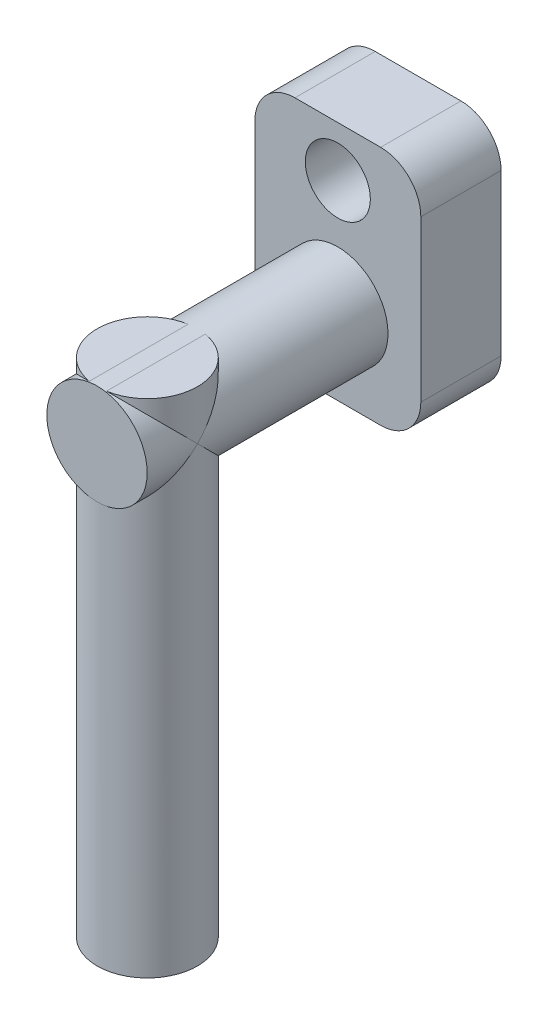
ISO-10303-21;
HEADER;
FILE_DESCRIPTION(('STEP AP214'),'2;1');
FILE_NAME('part.step','',(''),(''),'','','');
FILE_SCHEMA(('AUTOMOTIVE_DESIGN { 1 0 10303 214 1 1 1 1 }'));
ENDSEC;
DATA;
#1=APPLICATION_CONTEXT('core data for automotive mechanical design processes');
#2=APPLICATION_PROTOCOL_DEFINITION('international standard','automotive_design',2000,#1);
#3=PRODUCT_CONTEXT('',#1,'mechanical');
#4=PRODUCT('Part','Part','',(#3));
#5=PRODUCT_RELATED_PRODUCT_CATEGORY('part','',(#4));
#6=PRODUCT_DEFINITION_FORMATION('','',#4);
#7=PRODUCT_DEFINITION_CONTEXT('part definition',#1,'design');
#8=PRODUCT_DEFINITION('design','',#6,#7);
#9=PRODUCT_DEFINITION_SHAPE('','',#8);
#10=(LENGTH_UNIT() NAMED_UNIT(*) SI_UNIT(.MILLI.,.METRE.));
#11=(NAMED_UNIT(*) PLANE_ANGLE_UNIT() SI_UNIT($,.RADIAN.));
#12=(NAMED_UNIT(*) SI_UNIT($,.STERADIAN.) SOLID_ANGLE_UNIT());
#13=UNCERTAINTY_MEASURE_WITH_UNIT(LENGTH_MEASURE(1.E-05),#10,'distance_accuracy_value','');
#14=(GEOMETRIC_REPRESENTATION_CONTEXT(3) GLOBAL_UNCERTAINTY_ASSIGNED_CONTEXT((#13)) GLOBAL_UNIT_ASSIGNED_CONTEXT((#10,
#11,#12)) REPRESENTATION_CONTEXT('',''));
#15=CARTESIAN_POINT('',(0.,0.,0.));
#16=DIRECTION('',(0.,0.,1.));
#17=DIRECTION('',(1.,0.,0.));
#18=AXIS2_PLACEMENT_3D('',#15,#16,#17);
#19=CARTESIAN_POINT('',(4.135,6.,4.));
#20=DIRECTION('',(-1.,0.,0.));
#21=DIRECTION('',(0.,-1.,0.));
#22=AXIS2_PLACEMENT_3D('',#19,#20,#21);
#23=PLANE('',#22);
#24=DIRECTION('',(0.,1.,0.));
#25=VECTOR('',#24,1.);
#26=CARTESIAN_POINT('',(4.135,6.,4.));
#27=LINE('',#26,#25);
#28=CARTESIAN_POINT('',(4.135,-4.,4.));
#29=VERTEX_POINT('',#28);
#30=CARTESIAN_POINT('',(4.135,4.,4.));
#31=VERTEX_POINT('',#30);
#32=EDGE_CURVE('E184',#29,#31,#27,.T.);
#33=ORIENTED_EDGE('',*,*,#32,.F.);
#34=DIRECTION('',(0.,0.,-1.));
#35=VECTOR('',#34,1.);
#36=CARTESIAN_POINT('',(4.135,-4.,4.));
#37=LINE('',#36,#35);
#38=CARTESIAN_POINT('',(4.135,-4.,0.));
#39=VERTEX_POINT('',#38);
#40=EDGE_CURVE('E144',#29,#39,#37,.T.);
#41=ORIENTED_EDGE('',*,*,#40,.T.);
#42=DIRECTION('',(0.,1.,0.));
#43=VECTOR('',#42,1.);
#44=CARTESIAN_POINT('',(4.135,6.,0.));
#45=LINE('',#44,#43);
#46=CARTESIAN_POINT('',(4.135,4.,0.));
#47=VERTEX_POINT('',#46);
#48=EDGE_CURVE('E191',#39,#47,#45,.T.);
#49=ORIENTED_EDGE('',*,*,#48,.T.);
#50=DIRECTION('',(0.,0.,-1.));
#51=VECTOR('',#50,1.);
#52=CARTESIAN_POINT('',(4.135,4.,4.));
#53=LINE('',#52,#51);
#54=EDGE_CURVE('E171',#47,#31,#53,.F.);
#55=ORIENTED_EDGE('',*,*,#54,.T.);
#56=EDGE_LOOP('',(#33,#41,#49,#55));
#57=FACE_BOUND('',#56,.T.);
#58=ADVANCED_FACE('F35',(#57),#23,.F.);
#59=CARTESIAN_POINT('',(-4.135,6.,4.));
#60=DIRECTION('',(0.,-1.,0.));
#61=DIRECTION('',(1.,0.,0.));
#62=AXIS2_PLACEMENT_3D('',#59,#60,#61);
#63=PLANE('',#62);
#64=DIRECTION('',(-1.,0.,0.));
#65=VECTOR('',#64,1.);
#66=CARTESIAN_POINT('',(-4.135,6.,0.));
#67=LINE('',#66,#65);
#68=CARTESIAN_POINT('',(2.135,6.,0.));
#69=VERTEX_POINT('',#68);
#70=CARTESIAN_POINT('',(-2.135,6.,0.));
#71=VERTEX_POINT('',#70);
#72=EDGE_CURVE('E188',#69,#71,#67,.T.);
#73=ORIENTED_EDGE('',*,*,#72,.T.);
#74=DIRECTION('',(0.,0.,-1.));
#75=VECTOR('',#74,1.);
#76=CARTESIAN_POINT('',(-2.135,6.,4.));
#77=LINE('',#76,#75);
#78=CARTESIAN_POINT('',(-2.135,6.,4.));
#79=VERTEX_POINT('',#78);
#80=EDGE_CURVE('E142',#71,#79,#77,.F.);
#81=ORIENTED_EDGE('',*,*,#80,.T.);
#82=DIRECTION('',(-1.,0.,0.));
#83=VECTOR('',#82,1.);
#84=CARTESIAN_POINT('',(-4.135,6.,4.));
#85=LINE('',#84,#83);
#86=CARTESIAN_POINT('',(2.135,6.,4.));
#87=VERTEX_POINT('',#86);
#88=EDGE_CURVE('E199',#87,#79,#85,.T.);
#89=ORIENTED_EDGE('',*,*,#88,.F.);
#90=DIRECTION('',(0.,0.,-1.));
#91=VECTOR('',#90,1.);
#92=CARTESIAN_POINT('',(2.135,6.,4.));
#93=LINE('',#92,#91);
#94=EDGE_CURVE('E177',#87,#69,#93,.T.);
#95=ORIENTED_EDGE('',*,*,#94,.T.);
#96=EDGE_LOOP('',(#73,#81,#89,#95));
#97=FACE_BOUND('',#96,.T.);
#98=ADVANCED_FACE('F230',(#97),#63,.F.);
#99=CARTESIAN_POINT('',(-4.135,6.,4.));
#100=DIRECTION('',(1.,0.,0.));
#101=DIRECTION('',(0.,1.,0.));
#102=AXIS2_PLACEMENT_3D('',#99,#100,#101);
#103=PLANE('',#102);
#104=DIRECTION('',(0.,-1.,0.));
#105=VECTOR('',#104,1.);
#106=CARTESIAN_POINT('',(-4.135,6.,0.));
#107=LINE('',#106,#105);
#108=CARTESIAN_POINT('',(-4.135,4.,0.));
#109=VERTEX_POINT('',#108);
#110=CARTESIAN_POINT('',(-4.135,-4.,0.));
#111=VERTEX_POINT('',#110);
#112=EDGE_CURVE('E185',#109,#111,#107,.T.);
#113=ORIENTED_EDGE('',*,*,#112,.T.);
#114=DIRECTION('',(0.,0.,-1.));
#115=VECTOR('',#114,1.);
#116=CARTESIAN_POINT('',(-4.135,-4.,4.));
#117=LINE('',#116,#115);
#118=CARTESIAN_POINT('',(-4.135,-4.,4.));
#119=VERTEX_POINT('',#118);
#120=EDGE_CURVE('E153',#111,#119,#117,.F.);
#121=ORIENTED_EDGE('',*,*,#120,.T.);
#122=DIRECTION('',(0.,-1.,0.));
#123=VECTOR('',#122,1.);
#124=CARTESIAN_POINT('',(-4.135,6.,4.));
#125=LINE('',#124,#123);
#126=CARTESIAN_POINT('',(-4.135,4.,4.));
#127=VERTEX_POINT('',#126);
#128=EDGE_CURVE('E196',#127,#119,#125,.T.);
#129=ORIENTED_EDGE('',*,*,#128,.F.);
#130=DIRECTION('',(0.,0.,-1.));
#131=VECTOR('',#130,1.);
#132=CARTESIAN_POINT('',(-4.135,4.,4.));
#133=LINE('',#132,#131);
#134=EDGE_CURVE('E155',#127,#109,#133,.T.);
#135=ORIENTED_EDGE('',*,*,#134,.T.);
#136=EDGE_LOOP('',(#113,#121,#129,#135));
#137=FACE_BOUND('',#136,.T.);
#138=ADVANCED_FACE('F236',(#137),#103,.F.);
#139=CARTESIAN_POINT('',(-4.135,-6.,4.));
#140=DIRECTION('',(0.,1.,0.));
#141=DIRECTION('',(0.,0.,1.));
#142=AXIS2_PLACEMENT_3D('',#139,#140,#141);
#143=PLANE('',#142);
#144=DIRECTION('',(1.,0.,0.));
#145=VECTOR('',#144,1.);
#146=CARTESIAN_POINT('',(-4.135,-6.,4.));
#147=LINE('',#146,#145);
#148=CARTESIAN_POINT('',(-2.135,-6.,4.));
#149=VERTEX_POINT('',#148);
#150=CARTESIAN_POINT('',(2.135,-6.,4.));
#151=VERTEX_POINT('',#150);
#152=EDGE_CURVE('E180',#149,#151,#147,.T.);
#153=ORIENTED_EDGE('',*,*,#152,.F.);
#154=DIRECTION('',(0.,0.,-1.));
#155=VECTOR('',#154,1.);
#156=CARTESIAN_POINT('',(-2.135,-6.,4.));
#157=LINE('',#156,#155);
#158=CARTESIAN_POINT('',(-2.135,-6.,0.));
#159=VERTEX_POINT('',#158);
#160=EDGE_CURVE('E164',#149,#159,#157,.T.);
#161=ORIENTED_EDGE('',*,*,#160,.T.);
#162=DIRECTION('',(1.,0.,0.));
#163=VECTOR('',#162,1.);
#164=CARTESIAN_POINT('',(-4.135,-6.,0.));
#165=LINE('',#164,#163);
#166=CARTESIAN_POINT('',(2.135,-6.,0.));
#167=VERTEX_POINT('',#166);
#168=EDGE_CURVE('E181',#159,#167,#165,.T.);
#169=ORIENTED_EDGE('',*,*,#168,.T.);
#170=DIRECTION('',(0.,0.,-1.));
#171=VECTOR('',#170,1.);
#172=CARTESIAN_POINT('',(2.135,-6.,4.));
#173=LINE('',#172,#171);
#174=EDGE_CURVE('E167',#167,#151,#173,.F.);
#175=ORIENTED_EDGE('',*,*,#174,.T.);
#176=EDGE_LOOP('',(#153,#161,#169,#175));
#177=FACE_BOUND('',#176,.T.);
#178=ADVANCED_FACE('F280',(#177),#143,.F.);
#179=CARTESIAN_POINT('',(0.,0.,4.));
#180=DIRECTION('',(0.,0.,1.));
#181=DIRECTION('',(1.,0.,0.));
#182=AXIS2_PLACEMENT_3D('',#179,#180,#181);
#183=PLANE('',#182);
#184=CARTESIAN_POINT('',(0.,-1.86312088986675,4.));
#185=DIRECTION('',(0.,0.,1.));
#186=DIRECTION('',(1.,0.,0.));
#187=AXIS2_PLACEMENT_3D('',#184,#185,#186);
#188=CIRCLE('',#187,2.5);
#189=CARTESIAN_POINT('',(2.5,-1.86312088986675,4.));
#190=VERTEX_POINT('',#189);
#191=EDGE_CURVE('E209',#190,#190,#188,.T.);
#192=ORIENTED_EDGE('',*,*,#191,.F.);
#193=EDGE_LOOP('',(#192));
#194=FACE_BOUND('',#193,.T.);
#195=CARTESIAN_POINT('',(0.,3.5,4.));
#196=DIRECTION('',(0.,0.,1.));
#197=DIRECTION('',(1.,0.,0.));
#198=AXIS2_PLACEMENT_3D('',#195,#196,#197);
#199=CIRCLE('',#198,1.62);
#200=CARTESIAN_POINT('',(1.62,3.5,4.));
#201=VERTEX_POINT('',#200);
#202=EDGE_CURVE('E203',#201,#201,#199,.T.);
#203=ORIENTED_EDGE('',*,*,#202,.F.);
#204=EDGE_LOOP('',(#203));
#205=FACE_BOUND('',#204,.T.);
#206=ORIENTED_EDGE('',*,*,#128,.T.);
#207=CARTESIAN_POINT('',(-2.135,-4.,4.));
#208=DIRECTION('',(0.,0.,1.));
#209=DIRECTION('',(1.,0.,0.));
#210=AXIS2_PLACEMENT_3D('',#207,#208,#209);
#211=CIRCLE('',#210,2.);
#212=EDGE_CURVE('E147',#119,#149,#211,.T.);
#213=ORIENTED_EDGE('',*,*,#212,.T.);
#214=ORIENTED_EDGE('',*,*,#152,.T.);
#215=CARTESIAN_POINT('',(2.135,-4.,4.));
#216=DIRECTION('',(0.,0.,1.));
#217=DIRECTION('',(1.,0.,0.));
#218=AXIS2_PLACEMENT_3D('',#215,#216,#217);
#219=CIRCLE('',#218,2.);
#220=EDGE_CURVE('E149',#151,#29,#219,.T.);
#221=ORIENTED_EDGE('',*,*,#220,.T.);
#222=ORIENTED_EDGE('',*,*,#32,.T.);
#223=CARTESIAN_POINT('',(2.135,4.,4.));
#224=DIRECTION('',(0.,0.,1.));
#225=DIRECTION('',(1.,0.,0.));
#226=AXIS2_PLACEMENT_3D('',#223,#224,#225);
#227=CIRCLE('',#226,2.);
#228=EDGE_CURVE('E169',#31,#87,#227,.T.);
#229=ORIENTED_EDGE('',*,*,#228,.T.);
#230=ORIENTED_EDGE('',*,*,#88,.T.);
#231=CARTESIAN_POINT('',(-2.135,4.,4.));
#232=DIRECTION('',(0.,0.,1.));
#233=DIRECTION('',(1.,0.,0.));
#234=AXIS2_PLACEMENT_3D('',#231,#232,#233);
#235=CIRCLE('',#234,2.);
#236=EDGE_CURVE('E151',#79,#127,#235,.T.);
#237=ORIENTED_EDGE('',*,*,#236,.T.);
#238=EDGE_LOOP('',(#206,#213,#214,#221,#222,#229,#230,#237));
#239=FACE_BOUND('',#238,.T.);
#240=ADVANCED_FACE('F262',(#194,#205,#239),#183,.T.);
#241=CARTESIAN_POINT('',(0.,0.,0.));
#242=DIRECTION('',(0.,0.,1.));
#243=DIRECTION('',(1.,0.,0.));
#244=AXIS2_PLACEMENT_3D('',#241,#242,#243);
#245=PLANE('',#244);
#246=CARTESIAN_POINT('',(0.,3.5,0.));
#247=DIRECTION('',(0.,0.,1.));
#248=DIRECTION('',(1.,0.,0.));
#249=AXIS2_PLACEMENT_3D('',#246,#247,#248);
#250=CIRCLE('',#249,1.62);
#251=CARTESIAN_POINT('',(1.62,3.5,0.));
#252=VERTEX_POINT('',#251);
#253=EDGE_CURVE('E193',#252,#252,#250,.T.);
#254=ORIENTED_EDGE('',*,*,#253,.T.);
#255=EDGE_LOOP('',(#254));
#256=FACE_BOUND('',#255,.T.);
#257=ORIENTED_EDGE('',*,*,#168,.F.);
#258=CARTESIAN_POINT('',(-2.135,-4.,0.));
#259=DIRECTION('',(0.,0.,1.));
#260=DIRECTION('',(1.,0.,0.));
#261=AXIS2_PLACEMENT_3D('',#258,#259,#260);
#262=CIRCLE('',#261,2.);
#263=EDGE_CURVE('E158',#159,#111,#262,.F.);
#264=ORIENTED_EDGE('',*,*,#263,.T.);
#265=ORIENTED_EDGE('',*,*,#112,.F.);
#266=CARTESIAN_POINT('',(-2.135,4.,0.));
#267=DIRECTION('',(0.,0.,1.));
#268=DIRECTION('',(1.,0.,0.));
#269=AXIS2_PLACEMENT_3D('',#266,#267,#268);
#270=CIRCLE('',#269,2.);
#271=EDGE_CURVE('E162',#109,#71,#270,.F.);
#272=ORIENTED_EDGE('',*,*,#271,.T.);
#273=ORIENTED_EDGE('',*,*,#72,.F.);
#274=CARTESIAN_POINT('',(2.135,4.,0.));
#275=DIRECTION('',(0.,0.,1.));
#276=DIRECTION('',(1.,0.,0.));
#277=AXIS2_PLACEMENT_3D('',#274,#275,#276);
#278=CIRCLE('',#277,2.);
#279=EDGE_CURVE('E174',#69,#47,#278,.F.);
#280=ORIENTED_EDGE('',*,*,#279,.T.);
#281=ORIENTED_EDGE('',*,*,#48,.F.);
#282=CARTESIAN_POINT('',(2.135,-4.,0.));
#283=DIRECTION('',(0.,0.,1.));
#284=DIRECTION('',(1.,0.,0.));
#285=AXIS2_PLACEMENT_3D('',#282,#283,#284);
#286=CIRCLE('',#285,2.);
#287=EDGE_CURVE('E160',#39,#167,#286,.F.);
#288=ORIENTED_EDGE('',*,*,#287,.T.);
#289=EDGE_LOOP('',(#257,#264,#265,#272,#273,#280,#281,#288));
#290=FACE_BOUND('',#289,.T.);
#291=ADVANCED_FACE('F246',(#256,#290),#245,.F.);
#292=CARTESIAN_POINT('',(2.135,4.,4.));
#293=DIRECTION('',(0.,0.,-1.));
#294=DIRECTION('',(-1.,0.,0.));
#295=AXIS2_PLACEMENT_3D('',#292,#293,#294);
#296=CYLINDRICAL_SURFACE('',#295,2.);
#297=ORIENTED_EDGE('',*,*,#228,.F.);
#298=ORIENTED_EDGE('',*,*,#54,.F.);
#299=ORIENTED_EDGE('',*,*,#279,.F.);
#300=ORIENTED_EDGE('',*,*,#94,.F.);
#301=EDGE_LOOP('',(#297,#298,#299,#300));
#302=FACE_BOUND('',#301,.T.);
#303=ADVANCED_FACE('F242',(#302),#296,.T.);
#304=CARTESIAN_POINT('',(-2.135,-4.,4.));
#305=DIRECTION('',(0.,0.,-1.));
#306=DIRECTION('',(-1.,0.,0.));
#307=AXIS2_PLACEMENT_3D('',#304,#305,#306);
#308=CYLINDRICAL_SURFACE('',#307,2.);
#309=ORIENTED_EDGE('',*,*,#212,.F.);
#310=ORIENTED_EDGE('',*,*,#120,.F.);
#311=ORIENTED_EDGE('',*,*,#263,.F.);
#312=ORIENTED_EDGE('',*,*,#160,.F.);
#313=EDGE_LOOP('',(#309,#310,#311,#312));
#314=FACE_BOUND('',#313,.T.);
#315=ADVANCED_FACE('F245',(#314),#308,.T.);
#316=CARTESIAN_POINT('',(2.135,-4.,4.));
#317=DIRECTION('',(0.,0.,-1.));
#318=DIRECTION('',(-1.,0.,0.));
#319=AXIS2_PLACEMENT_3D('',#316,#317,#318);
#320=CYLINDRICAL_SURFACE('',#319,2.);
#321=ORIENTED_EDGE('',*,*,#220,.F.);
#322=ORIENTED_EDGE('',*,*,#174,.F.);
#323=ORIENTED_EDGE('',*,*,#287,.F.);
#324=ORIENTED_EDGE('',*,*,#40,.F.);
#325=EDGE_LOOP('',(#321,#322,#323,#324));
#326=FACE_BOUND('',#325,.T.);
#327=ADVANCED_FACE('F249',(#326),#320,.T.);
#328=CARTESIAN_POINT('',(-2.135,4.,4.));
#329=DIRECTION('',(0.,0.,-1.));
#330=DIRECTION('',(-1.,0.,0.));
#331=AXIS2_PLACEMENT_3D('',#328,#329,#330);
#332=CYLINDRICAL_SURFACE('',#331,2.);
#333=ORIENTED_EDGE('',*,*,#236,.F.);
#334=ORIENTED_EDGE('',*,*,#80,.F.);
#335=ORIENTED_EDGE('',*,*,#271,.F.);
#336=ORIENTED_EDGE('',*,*,#134,.F.);
#337=EDGE_LOOP('',(#333,#334,#335,#336));
#338=FACE_BOUND('',#337,.T.);
#339=ADVANCED_FACE('F37',(#338),#332,.T.);
#340=CARTESIAN_POINT('',(0.,3.5,0.));
#341=DIRECTION('',(0.,0.,1.));
#342=DIRECTION('',(1.,0.,0.));
#343=AXIS2_PLACEMENT_3D('',#340,#341,#342);
#344=CYLINDRICAL_SURFACE('',#343,1.62);
#345=ORIENTED_EDGE('',*,*,#253,.F.);
#346=EDGE_LOOP('',(#345));
#347=FACE_BOUND('',#346,.T.);
#348=ORIENTED_EDGE('',*,*,#202,.T.);
#349=EDGE_LOOP('',(#348));
#350=FACE_BOUND('',#349,.T.);
#351=ADVANCED_FACE('F256',(#347,#350),#344,.F.);
#352=CARTESIAN_POINT('',(0.,-1.86312088986675,16.));
#353=DIRECTION('',(0.,0.,-1.));
#354=DIRECTION('',(-1.,0.,0.));
#355=AXIS2_PLACEMENT_3D('',#352,#353,#354);
#356=CYLINDRICAL_SURFACE('',#355,2.5);
#357=DIRECTION('',(0.,0.,-1.));
#358=VECTOR('',#357,1.);
#359=CARTESIAN_POINT('',(0.42782646236765,0.6,16.));
#360=LINE('',#359,#358);
#361=CARTESIAN_POINT('',(0.42782646236765,0.6,15.9547010899782));
#362=VERTEX_POINT('',#361);
#363=CARTESIAN_POINT('',(0.42782646236765,0.6,11.0284593102447));
#364=VERTEX_POINT('',#363);
#365=EDGE_CURVE('E121',#362,#364,#360,.T.);
#366=ORIENTED_EDGE('',*,*,#365,.T.);
#367=CARTESIAN_POINT('',(0.,-1.86312088986675,13.4915802001115));
#368=DIRECTION('',(0.,-0.707106781186547,-0.707106781186547));
#369=DIRECTION('',(0.,0.707106781186547,-0.707106781186547));
#370=AXIS2_PLACEMENT_3D('',#367,#368,#369);
#371=ELLIPSE('',#370,3.53553390593274,2.5);
#372=CARTESIAN_POINT('',(2.5,-1.86312088986675,13.4915802001115));
#373=VERTEX_POINT('',#372);
#374=EDGE_CURVE('E11',#364,#373,#371,.T.);
#375=ORIENTED_EDGE('',*,*,#374,.T.);
#376=CARTESIAN_POINT('',(0.,-1.86312088986675,13.4915802001115));
#377=DIRECTION('',(0.,0.707106781186547,-0.707106781186547));
#378=DIRECTION('',(0.,-0.707106781186547,-0.707106781186547));
#379=AXIS2_PLACEMENT_3D('',#376,#377,#378);
#380=ELLIPSE('',#379,3.53553390593274,2.5);
#381=CARTESIAN_POINT('',(-2.5,-1.86312088986675,13.4915802001115));
#382=VERTEX_POINT('',#381);
#383=EDGE_CURVE('E134',#373,#382,#380,.T.);
#384=ORIENTED_EDGE('',*,*,#383,.T.);
#385=CARTESIAN_POINT('',(-0.42782646236765,0.6,11.0284593102447));
#386=VERTEX_POINT('',#385);
#387=EDGE_CURVE('E45',#382,#386,#371,.T.);
#388=ORIENTED_EDGE('',*,*,#387,.T.);
#389=DIRECTION('',(0.,0.,-1.));
#390=VECTOR('',#389,1.);
#391=CARTESIAN_POINT('',(-0.42782646236765,0.6,16.));
#392=LINE('',#391,#390);
#393=CARTESIAN_POINT('',(-0.42782646236765,0.6,15.9547010899782));
#394=VERTEX_POINT('',#393);
#395=EDGE_CURVE('E139',#386,#394,#392,.F.);
#396=ORIENTED_EDGE('',*,*,#395,.T.);
#397=CARTESIAN_POINT('',(0.,-1.86312088986675,13.4915802001115));
#398=DIRECTION('',(0.,0.707106781186547,-0.707106781186547));
#399=DIRECTION('',(0.,-0.707106781186547,-0.707106781186547));
#400=AXIS2_PLACEMENT_3D('',#397,#398,#399);
#401=ELLIPSE('',#400,3.53553390593274,2.5);
#402=EDGE_CURVE('E132',#394,#382,#401,.F.);
#403=ORIENTED_EDGE('',*,*,#402,.T.);
#404=CARTESIAN_POINT('',(0.,-1.86312088986675,13.4915802001115));
#405=DIRECTION('',(0.,-0.707106781186547,-0.707106781186547));
#406=DIRECTION('',(0.,0.707106781186547,-0.707106781186547));
#407=AXIS2_PLACEMENT_3D('',#404,#405,#406);
#408=ELLIPSE('',#407,3.53553390593274,2.5);
#409=EDGE_CURVE('E39',#382,#373,#408,.F.);
#410=ORIENTED_EDGE('',*,*,#409,.T.);
#411=EDGE_CURVE('E52',#373,#362,#401,.F.);
#412=ORIENTED_EDGE('',*,*,#411,.T.);
#413=EDGE_LOOP('',(#366,#375,#384,#388,#396,#403,#410,#412));
#414=FACE_BOUND('',#413,.T.);
#415=CARTESIAN_POINT('',(0.,-1.86312088986675,16.));
#416=DIRECTION('',(0.,0.,1.));
#417=DIRECTION('',(1.,0.,0.));
#418=AXIS2_PLACEMENT_3D('',#415,#416,#417);
#419=CIRCLE('',#418,2.5);
#420=CARTESIAN_POINT('',(2.5,-1.86312088986675,16.));
#421=VERTEX_POINT('',#420);
#422=EDGE_CURVE('E206',#421,#421,#419,.T.);
#423=ORIENTED_EDGE('',*,*,#422,.F.);
#424=EDGE_LOOP('',(#423));
#425=FACE_BOUND('',#424,.T.);
#426=ORIENTED_EDGE('',*,*,#191,.T.);
#427=EDGE_LOOP('',(#426));
#428=FACE_BOUND('',#427,.T.);
#429=ADVANCED_FACE('F129',(#414,#425,#428),#356,.T.);
#430=CARTESIAN_POINT('',(0.,-1.86312088986675,16.));
#431=DIRECTION('',(0.,0.,1.));
#432=DIRECTION('',(1.,0.,0.));
#433=AXIS2_PLACEMENT_3D('',#430,#431,#432);
#434=PLANE('',#433);
#435=ORIENTED_EDGE('',*,*,#422,.T.);
#436=EDGE_LOOP('',(#435));
#437=FACE_BOUND('',#436,.T.);
#438=ADVANCED_FACE('F318',(#437),#434,.T.);
#439=CARTESIAN_POINT('',(0.,0.6,13.4915802001115));
#440=DIRECTION('',(0.,1.,0.));
#441=DIRECTION('',(0.,0.,1.));
#442=AXIS2_PLACEMENT_3D('',#439,#440,#441);
#443=PLANE('',#442);
#444=ORIENTED_EDGE('',*,*,#395,.F.);
#445=CARTESIAN_POINT('',(0.,0.6,13.4915802001115));
#446=DIRECTION('',(0.,1.,0.));
#447=DIRECTION('',(0.,0.,1.));
#448=AXIS2_PLACEMENT_3D('',#445,#446,#447);
#449=CIRCLE('',#448,2.5);
#450=EDGE_CURVE('E59',#386,#394,#449,.T.);
#451=ORIENTED_EDGE('',*,*,#450,.T.);
#452=EDGE_LOOP('',(#444,#451));
#453=FACE_BOUND('',#452,.T.);
#454=ADVANCED_FACE('F323',(#453),#443,.T.);
#455=CARTESIAN_POINT('',(0.,-24.4,13.4915802001115));
#456=DIRECTION('',(0.,1.,0.));
#457=DIRECTION('',(0.,0.,1.));
#458=AXIS2_PLACEMENT_3D('',#455,#456,#457);
#459=CYLINDRICAL_SURFACE('',#458,2.5);
#460=ORIENTED_EDGE('',*,*,#402,.F.);
#461=ORIENTED_EDGE('',*,*,#450,.F.);
#462=ORIENTED_EDGE('',*,*,#387,.F.);
#463=EDGE_LOOP('',(#460,#461,#462));
#464=FACE_BOUND('',#463,.T.);
#465=ADVANCED_FACE('F227',(#464),#459,.T.);
#466=ORIENTED_EDGE('',*,*,#365,.F.);
#467=EDGE_CURVE('E123',#362,#364,#449,.T.);
#468=ORIENTED_EDGE('',*,*,#467,.T.);
#469=EDGE_LOOP('',(#466,#468));
#470=FACE_BOUND('',#469,.T.);
#471=ADVANCED_FACE('F122',(#470),#443,.T.);
#472=ORIENTED_EDGE('',*,*,#411,.F.);
#473=ORIENTED_EDGE('',*,*,#374,.F.);
#474=ORIENTED_EDGE('',*,*,#467,.F.);
#475=EDGE_LOOP('',(#472,#473,#474));
#476=FACE_BOUND('',#475,.T.);
#477=ADVANCED_FACE('F125',(#476),#459,.T.);
#478=CARTESIAN_POINT('',(0.,-24.4,13.4915802001115));
#479=DIRECTION('',(0.,1.,0.));
#480=DIRECTION('',(0.,0.,1.));
#481=AXIS2_PLACEMENT_3D('',#478,#479,#480);
#482=CIRCLE('',#481,2.5);
#483=CARTESIAN_POINT('',(0.,-24.4,15.9915802001115));
#484=VERTEX_POINT('',#483);
#485=EDGE_CURVE('E126',#484,#484,#482,.T.);
#486=ORIENTED_EDGE('',*,*,#485,.T.);
#487=EDGE_LOOP('',(#486));
#488=FACE_BOUND('',#487,.T.);
#489=ORIENTED_EDGE('',*,*,#383,.F.);
#490=ORIENTED_EDGE('',*,*,#409,.F.);
#491=EDGE_LOOP('',(#489,#490));
#492=FACE_BOUND('',#491,.T.);
#493=ADVANCED_FACE('F217',(#488,#492),#459,.T.);
#494=CARTESIAN_POINT('',(0.,-24.4,13.4915802001115));
#495=DIRECTION('',(0.,1.,0.));
#496=DIRECTION('',(0.,0.,1.));
#497=AXIS2_PLACEMENT_3D('',#494,#495,#496);
#498=PLANE('',#497);
#499=ORIENTED_EDGE('',*,*,#485,.F.);
#500=EDGE_LOOP('',(#499));
#501=FACE_BOUND('',#500,.T.);
#502=ADVANCED_FACE('F220',(#501),#498,.F.);
#503=CLOSED_SHELL('',(#58,#98,#138,#178,#240,#291,#303,#315,#327,#339,#351,#429,#438,#454,#465,
#471,#477,#493,#502));
#504=MANIFOLD_SOLID_BREP('B2',#503);
#505=ADVANCED_BREP_SHAPE_REPRESENTATION('',(#18,#504),#14);
#506=SHAPE_DEFINITION_REPRESENTATION(#9,#505);
ENDSEC;
END-ISO-10303-21;
